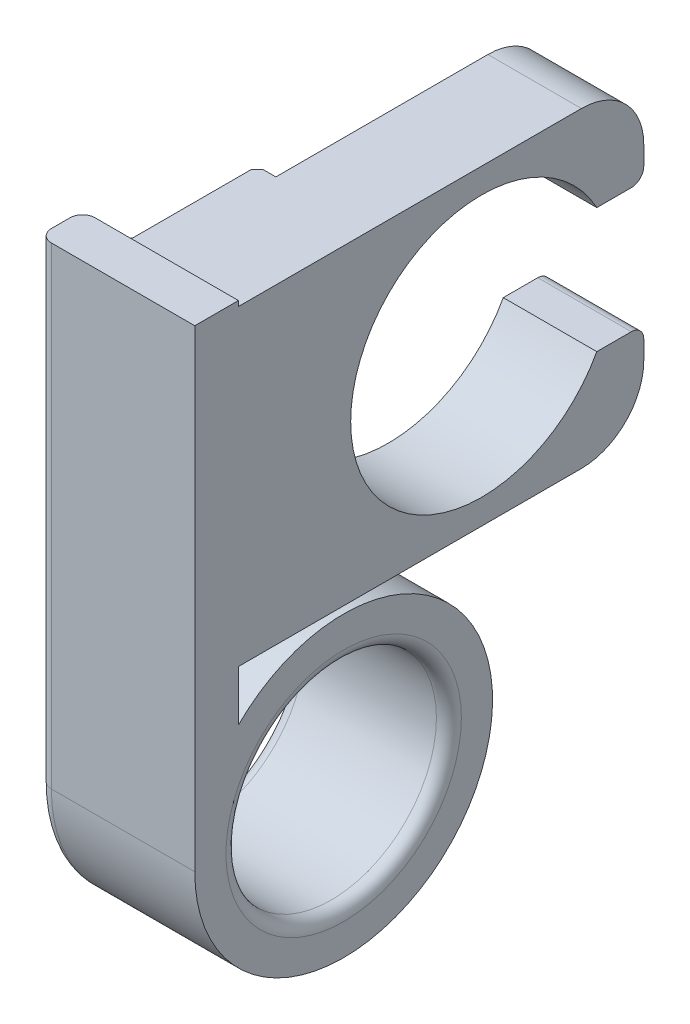
ISO-10303-21;
HEADER;
FILE_DESCRIPTION(('STEP AP214'),'2;1');
FILE_NAME('part.step','',(''),(''),'','','');
FILE_SCHEMA(('AUTOMOTIVE_DESIGN { 1 0 10303 214 1 1 1 1 }'));
ENDSEC;
DATA;
#1=APPLICATION_CONTEXT('core data for automotive mechanical design processes');
#2=APPLICATION_PROTOCOL_DEFINITION('international standard','automotive_design',2000,#1);
#3=PRODUCT_CONTEXT('',#1,'mechanical');
#4=PRODUCT('Part','Part','',(#3));
#5=PRODUCT_RELATED_PRODUCT_CATEGORY('part','',(#4));
#6=PRODUCT_DEFINITION_FORMATION('','',#4);
#7=PRODUCT_DEFINITION_CONTEXT('part definition',#1,'design');
#8=PRODUCT_DEFINITION('design','',#6,#7);
#9=PRODUCT_DEFINITION_SHAPE('','',#8);
#10=(LENGTH_UNIT() NAMED_UNIT(*) SI_UNIT(.MILLI.,.METRE.));
#11=(NAMED_UNIT(*) PLANE_ANGLE_UNIT() SI_UNIT($,.RADIAN.));
#12=(NAMED_UNIT(*) SI_UNIT($,.STERADIAN.) SOLID_ANGLE_UNIT());
#13=UNCERTAINTY_MEASURE_WITH_UNIT(LENGTH_MEASURE(1.E-05),#10,'distance_accuracy_value','');
#14=(GEOMETRIC_REPRESENTATION_CONTEXT(3) GLOBAL_UNCERTAINTY_ASSIGNED_CONTEXT((#13)) GLOBAL_UNIT_ASSIGNED_CONTEXT((#10,
#11,#12)) REPRESENTATION_CONTEXT('',''));
#15=CARTESIAN_POINT('',(0.,0.,0.));
#16=DIRECTION('',(0.,0.,1.));
#17=DIRECTION('',(1.,0.,0.));
#18=AXIS2_PLACEMENT_3D('',#15,#16,#17);
#19=CARTESIAN_POINT('',(0.,75.83,16.875));
#20=DIRECTION('',(0.,0.,1.));
#21=DIRECTION('',(1.,0.,0.));
#22=AXIS2_PLACEMENT_3D('',#19,#20,#21);
#23=PLANE('',#22);
#24=DIRECTION('',(1.,0.,0.));
#25=VECTOR('',#24,1.);
#26=CARTESIAN_POINT('',(10.,75.,16.875));
#27=LINE('',#26,#25);
#28=CARTESIAN_POINT('',(6.00000000000002,75.,16.875));
#29=VERTEX_POINT('',#28);
#30=CARTESIAN_POINT('',(25.,75.,16.875));
#31=VERTEX_POINT('',#30);
#32=EDGE_CURVE('E272',#29,#31,#27,.T.);
#33=ORIENTED_EDGE('',*,*,#32,.F.);
#34=DIRECTION('',(0.,-1.,0.));
#35=VECTOR('',#34,1.);
#36=CARTESIAN_POINT('',(6.00000000000002,75.83,16.875));
#37=LINE('',#36,#35);
#38=CARTESIAN_POINT('',(6.00000000000002,25.,16.875));
#39=VERTEX_POINT('',#38);
#40=EDGE_CURVE('E546',#29,#39,#37,.T.);
#41=ORIENTED_EDGE('',*,*,#40,.T.);
#42=DIRECTION('',(1.,0.,0.));
#43=VECTOR('',#42,1.);
#44=CARTESIAN_POINT('',(10.,25.,16.875));
#45=LINE('',#44,#43);
#46=CARTESIAN_POINT('',(25.,25.,16.875));
#47=VERTEX_POINT('',#46);
#48=EDGE_CURVE('E233',#39,#47,#45,.T.);
#49=ORIENTED_EDGE('',*,*,#48,.T.);
#50=DIRECTION('',(0.,-1.,0.));
#51=VECTOR('',#50,1.);
#52=CARTESIAN_POINT('',(25.,75.83,16.875));
#53=LINE('',#52,#51);
#54=CARTESIAN_POINT('',(25.,16.8893457540545,16.875));
#55=VERTEX_POINT('',#54);
#56=EDGE_CURVE('E298',#47,#55,#53,.T.);
#57=ORIENTED_EDGE('',*,*,#56,.T.);
#58=DIRECTION('',(-1.,0.,0.));
#59=VECTOR('',#58,1.);
#60=CARTESIAN_POINT('',(25.,16.8893457540545,16.875));
#61=LINE('',#60,#59);
#62=CARTESIAN_POINT('',(2.,16.8893457540545,16.875));
#63=VERTEX_POINT('',#62);
#64=EDGE_CURVE('E309',#55,#63,#61,.T.);
#65=ORIENTED_EDGE('',*,*,#64,.T.);
#66=DIRECTION('',(0.,-1.,0.));
#67=VECTOR('',#66,1.);
#68=CARTESIAN_POINT('',(2.,75.83,16.875));
#69=LINE('',#68,#67);
#70=CARTESIAN_POINT('',(2.,75.83,16.875));
#71=VERTEX_POINT('',#70);
#72=EDGE_CURVE('E368',#63,#71,#69,.F.);
#73=ORIENTED_EDGE('',*,*,#72,.T.);
#74=DIRECTION('',(-1.,0.,0.));
#75=VECTOR('',#74,1.);
#76=CARTESIAN_POINT('',(0.,75.83,16.875));
#77=LINE('',#76,#75);
#78=CARTESIAN_POINT('',(25.,75.83,16.875));
#79=VERTEX_POINT('',#78);
#80=EDGE_CURVE('E294',#79,#71,#77,.T.);
#81=ORIENTED_EDGE('',*,*,#80,.F.);
#82=EDGE_CURVE('E301',#79,#31,#53,.T.);
#83=ORIENTED_EDGE('',*,*,#82,.T.);
#84=EDGE_LOOP('',(#33,#41,#49,#57,#65,#73,#81,#83));
#85=FACE_BOUND('',#84,.T.);
#86=ADVANCED_FACE('F49',(#85),#23,.F.);
#87=CARTESIAN_POINT('',(10.,0.,0.));
#88=DIRECTION('',(1.,0.,0.));
#89=DIRECTION('',(0.,0.,-1.));
#90=AXIS2_PLACEMENT_3D('',#87,#88,#89);
#91=PLANE('',#90);
#92=DIRECTION('',(0.,-1.,0.));
#93=VECTOR('',#92,1.);
#94=CARTESIAN_POINT('',(10.,25.,-4.125));
#95=LINE('',#94,#93);
#96=CARTESIAN_POINT('',(10.,75.,-4.125));
#97=VERTEX_POINT('',#96);
#98=CARTESIAN_POINT('',(10.,60.816653826392,-4.125));
#99=VERTEX_POINT('',#98);
#100=EDGE_CURVE('E207',#97,#99,#95,.T.);
#101=ORIENTED_EDGE('',*,*,#100,.F.);
#102=DIRECTION('',(0.,0.,1.));
#103=VECTOR('',#102,1.);
#104=CARTESIAN_POINT('',(10.,75.,0.));
#105=LINE('',#104,#103);
#106=CARTESIAN_POINT('',(10.,75.,-38.125));
#107=VERTEX_POINT('',#106);
#108=EDGE_CURVE('E219',#107,#97,#105,.T.);
#109=ORIENTED_EDGE('',*,*,#108,.F.);
#110=CARTESIAN_POINT('',(10.,65.,-38.125));
#111=DIRECTION('',(1.,0.,0.));
#112=DIRECTION('',(0.,0.,-1.));
#113=AXIS2_PLACEMENT_3D('',#110,#111,#112);
#114=CIRCLE('',#113,10.);
#115=CARTESIAN_POINT('',(10.,65.,-48.125));
#116=VERTEX_POINT('',#115);
#117=EDGE_CURVE('E332',#107,#116,#114,.F.);
#118=ORIENTED_EDGE('',*,*,#117,.T.);
#119=DIRECTION('',(0.,-1.,0.));
#120=VECTOR('',#119,1.);
#121=CARTESIAN_POINT('',(10.,0.,-48.125));
#122=LINE('',#121,#120);
#123=CARTESIAN_POINT('',(10.,62.,-48.125));
#124=VERTEX_POINT('',#123);
#125=EDGE_CURVE('E234',#116,#124,#122,.T.);
#126=ORIENTED_EDGE('',*,*,#125,.T.);
#127=CARTESIAN_POINT('',(10.,62.,-46.125));
#128=DIRECTION('',(1.,0.,0.));
#129=DIRECTION('',(0.,0.,-1.));
#130=AXIS2_PLACEMENT_3D('',#127,#128,#129);
#131=CIRCLE('',#130,2.);
#132=CARTESIAN_POINT('',(10.,60.,-46.125));
#133=VERTEX_POINT('',#132);
#134=EDGE_CURVE('E521',#124,#133,#131,.F.);
#135=ORIENTED_EDGE('',*,*,#134,.T.);
#136=DIRECTION('',(0.,0.,1.));
#137=VECTOR('',#136,1.);
#138=CARTESIAN_POINT('',(10.,60.,0.));
#139=LINE('',#138,#137);
#140=CARTESIAN_POINT('',(10.,60.,-40.5911853126194));
#141=VERTEX_POINT('',#140);
#142=EDGE_CURVE('E242',#133,#141,#139,.T.);
#143=ORIENTED_EDGE('',*,*,#142,.T.);
#144=CARTESIAN_POINT('',(10.,50.,-22.125));
#145=DIRECTION('',(1.,0.,0.));
#146=DIRECTION('',(0.,0.,-1.));
#147=AXIS2_PLACEMENT_3D('',#144,#145,#146);
#148=CIRCLE('',#147,21.);
#149=EDGE_CURVE('E222',#99,#141,#148,.F.);
#150=ORIENTED_EDGE('',*,*,#149,.F.);
#151=EDGE_LOOP('',(#101,#109,#118,#126,#135,#143,#150));
#152=FACE_BOUND('',#151,.T.);
#153=ADVANCED_FACE('F218',(#152),#91,.F.);
#154=DIRECTION('',(0.,-1.,0.));
#155=VECTOR('',#154,1.);
#156=CARTESIAN_POINT('',(10.,0.,-4.125));
#157=LINE('',#156,#155);
#158=CARTESIAN_POINT('',(10.,39.183346173608,-4.125));
#159=VERTEX_POINT('',#158);
#160=CARTESIAN_POINT('',(10.,25.,-4.125));
#161=VERTEX_POINT('',#160);
#162=EDGE_CURVE('E534',#159,#161,#157,.T.);
#163=ORIENTED_EDGE('',*,*,#162,.F.);
#164=CARTESIAN_POINT('',(10.,40.,-40.5911853126194));
#165=VERTEX_POINT('',#164);
#166=EDGE_CURVE('E581',#165,#159,#148,.F.);
#167=ORIENTED_EDGE('',*,*,#166,.F.);
#168=DIRECTION('',(0.,0.,1.));
#169=VECTOR('',#168,1.);
#170=CARTESIAN_POINT('',(10.,40.,0.));
#171=LINE('',#170,#169);
#172=CARTESIAN_POINT('',(10.,40.,-46.125));
#173=VERTEX_POINT('',#172);
#174=EDGE_CURVE('E578',#173,#165,#171,.T.);
#175=ORIENTED_EDGE('',*,*,#174,.F.);
#176=CARTESIAN_POINT('',(10.,38.,-46.125));
#177=DIRECTION('',(1.,0.,0.));
#178=DIRECTION('',(0.,0.,-1.));
#179=AXIS2_PLACEMENT_3D('',#176,#177,#178);
#180=CIRCLE('',#179,2.);
#181=CARTESIAN_POINT('',(10.,38.,-48.125));
#182=VERTEX_POINT('',#181);
#183=EDGE_CURVE('E524',#173,#182,#180,.F.);
#184=ORIENTED_EDGE('',*,*,#183,.T.);
#185=DIRECTION('',(0.,-1.,0.));
#186=VECTOR('',#185,1.);
#187=CARTESIAN_POINT('',(10.,0.,-48.125));
#188=LINE('',#187,#186);
#189=CARTESIAN_POINT('',(10.,35.,-48.125));
#190=VERTEX_POINT('',#189);
#191=EDGE_CURVE('E575',#182,#190,#188,.T.);
#192=ORIENTED_EDGE('',*,*,#191,.T.);
#193=CARTESIAN_POINT('',(10.,35.,-38.125));
#194=DIRECTION('',(1.,0.,0.));
#195=DIRECTION('',(0.,0.,-1.));
#196=AXIS2_PLACEMENT_3D('',#193,#194,#195);
#197=CIRCLE('',#196,10.);
#198=CARTESIAN_POINT('',(10.,25.,-38.125));
#199=VERTEX_POINT('',#198);
#200=EDGE_CURVE('E335',#190,#199,#197,.F.);
#201=ORIENTED_EDGE('',*,*,#200,.T.);
#202=DIRECTION('',(0.,0.,-1.));
#203=VECTOR('',#202,1.);
#204=CARTESIAN_POINT('',(10.,25.,0.));
#205=LINE('',#204,#203);
#206=EDGE_CURVE('E271',#161,#199,#205,.T.);
#207=ORIENTED_EDGE('',*,*,#206,.F.);
#208=EDGE_LOOP('',(#163,#167,#175,#184,#192,#201,#207));
#209=FACE_BOUND('',#208,.T.);
#210=ADVANCED_FACE('F446',(#209),#91,.F.);
#211=CARTESIAN_POINT('',(25.,0.,0.));
#212=DIRECTION('',(-1.,0.,0.));
#213=DIRECTION('',(0.,0.,1.));
#214=AXIS2_PLACEMENT_3D('',#211,#212,#213);
#215=CYLINDRICAL_SURFACE('',#214,23.875);
#216=DIRECTION('',(1.,0.,0.));
#217=VECTOR('',#216,1.);
#218=CARTESIAN_POINT('',(0.,0.,23.875));
#219=LINE('',#218,#217);
#220=CARTESIAN_POINT('',(2.,0.,23.875));
#221=VERTEX_POINT('',#220);
#222=CARTESIAN_POINT('',(25.,0.,23.875));
#223=VERTEX_POINT('',#222);
#224=EDGE_CURVE('E276',#221,#223,#219,.T.);
#225=ORIENTED_EDGE('',*,*,#224,.F.);
#226=CARTESIAN_POINT('',(2.,0.,0.));
#227=DIRECTION('',(1.,0.,0.));
#228=DIRECTION('',(0.,0.,-1.));
#229=AXIS2_PLACEMENT_3D('',#226,#227,#228);
#230=CIRCLE('',#229,23.875);
#231=EDGE_CURVE('E371',#221,#63,#230,.T.);
#232=ORIENTED_EDGE('',*,*,#231,.T.);
#233=ORIENTED_EDGE('',*,*,#64,.F.);
#234=CARTESIAN_POINT('',(25.,0.,0.));
#235=DIRECTION('',(1.,0.,0.));
#236=DIRECTION('',(0.,0.,-1.));
#237=AXIS2_PLACEMENT_3D('',#234,#235,#236);
#238=CIRCLE('',#237,23.875);
#239=EDGE_CURVE('E313',#223,#55,#238,.T.);
#240=ORIENTED_EDGE('',*,*,#239,.F.);
#241=EDGE_LOOP('',(#225,#232,#233,#240));
#242=FACE_BOUND('',#241,.T.);
#243=ADVANCED_FACE('F464',(#242),#215,.T.);
#244=CARTESIAN_POINT('',(25.,0.,0.));
#245=DIRECTION('',(1.,0.,0.));
#246=DIRECTION('',(0.,0.,-1.));
#247=AXIS2_PLACEMENT_3D('',#244,#245,#246);
#248=PLANE('',#247);
#249=CARTESIAN_POINT('',(25.,0.,0.));
#250=DIRECTION('',(1.,0.,0.));
#251=DIRECTION('',(0.,0.,-1.));
#252=AXIS2_PLACEMENT_3D('',#249,#250,#251);
#253=CIRCLE('',#252,18.875);
#254=CARTESIAN_POINT('',(25.,0.,-18.875));
#255=VERTEX_POINT('',#254);
#256=EDGE_CURVE('E382',#255,#255,#253,.F.);
#257=ORIENTED_EDGE('',*,*,#256,.T.);
#258=EDGE_LOOP('',(#257));
#259=FACE_BOUND('',#258,.T.);
#260=DIRECTION('',(0.,-1.,0.));
#261=VECTOR('',#260,1.);
#262=CARTESIAN_POINT('',(25.,0.,-48.125));
#263=LINE('',#262,#261);
#264=CARTESIAN_POINT('',(25.,38.,-48.125));
#265=VERTEX_POINT('',#264);
#266=CARTESIAN_POINT('',(25.,35.,-48.125));
#267=VERTEX_POINT('',#266);
#268=EDGE_CURVE('E250',#265,#267,#263,.T.);
#269=ORIENTED_EDGE('',*,*,#268,.F.);
#270=CARTESIAN_POINT('',(25.,38.,-46.125));
#271=DIRECTION('',(1.,0.,0.));
#272=DIRECTION('',(0.,0.,-1.));
#273=AXIS2_PLACEMENT_3D('',#270,#271,#272);
#274=CIRCLE('',#273,2.);
#275=CARTESIAN_POINT('',(25.,40.,-46.125));
#276=VERTEX_POINT('',#275);
#277=EDGE_CURVE('E516',#265,#276,#274,.T.);
#278=ORIENTED_EDGE('',*,*,#277,.T.);
#279=DIRECTION('',(0.,0.,1.));
#280=VECTOR('',#279,1.);
#281=CARTESIAN_POINT('',(25.,40.,0.));
#282=LINE('',#281,#280);
#283=CARTESIAN_POINT('',(25.,40.,-40.5911853126194));
#284=VERTEX_POINT('',#283);
#285=EDGE_CURVE('E254',#276,#284,#282,.T.);
#286=ORIENTED_EDGE('',*,*,#285,.T.);
#287=CARTESIAN_POINT('',(25.,50.,-22.125));
#288=DIRECTION('',(1.,0.,0.));
#289=DIRECTION('',(0.,0.,-1.));
#290=AXIS2_PLACEMENT_3D('',#287,#288,#289);
#291=CIRCLE('',#290,21.);
#292=CARTESIAN_POINT('',(25.,60.,-40.5911853126194));
#293=VERTEX_POINT('',#292);
#294=EDGE_CURVE('E257',#284,#293,#291,.F.);
#295=ORIENTED_EDGE('',*,*,#294,.T.);
#296=DIRECTION('',(0.,0.,1.));
#297=VECTOR('',#296,1.);
#298=CARTESIAN_POINT('',(25.,60.,0.));
#299=LINE('',#298,#297);
#300=CARTESIAN_POINT('',(25.,60.,-46.125));
#301=VERTEX_POINT('',#300);
#302=EDGE_CURVE('E261',#301,#293,#299,.T.);
#303=ORIENTED_EDGE('',*,*,#302,.F.);
#304=CARTESIAN_POINT('',(25.,62.,-46.125));
#305=DIRECTION('',(1.,0.,0.));
#306=DIRECTION('',(0.,0.,-1.));
#307=AXIS2_PLACEMENT_3D('',#304,#305,#306);
#308=CIRCLE('',#307,2.);
#309=CARTESIAN_POINT('',(25.,62.,-48.125));
#310=VERTEX_POINT('',#309);
#311=EDGE_CURVE('E514',#301,#310,#308,.T.);
#312=ORIENTED_EDGE('',*,*,#311,.T.);
#313=DIRECTION('',(0.,-1.,0.));
#314=VECTOR('',#313,1.);
#315=CARTESIAN_POINT('',(25.,0.,-48.125));
#316=LINE('',#315,#314);
#317=CARTESIAN_POINT('',(25.,65.,-48.125));
#318=VERTEX_POINT('',#317);
#319=EDGE_CURVE('E264',#318,#310,#316,.T.);
#320=ORIENTED_EDGE('',*,*,#319,.F.);
#321=CARTESIAN_POINT('',(25.,65.,-38.125));
#322=DIRECTION('',(1.,0.,0.));
#323=DIRECTION('',(0.,0.,-1.));
#324=AXIS2_PLACEMENT_3D('',#321,#322,#323);
#325=CIRCLE('',#324,10.);
#326=CARTESIAN_POINT('',(25.,75.,-38.125));
#327=VERTEX_POINT('',#326);
#328=EDGE_CURVE('E321',#318,#327,#325,.T.);
#329=ORIENTED_EDGE('',*,*,#328,.T.);
#330=DIRECTION('',(0.,0.,1.));
#331=VECTOR('',#330,1.);
#332=CARTESIAN_POINT('',(25.,75.,0.));
#333=LINE('',#332,#331);
#334=EDGE_CURVE('E268',#327,#31,#333,.T.);
#335=ORIENTED_EDGE('',*,*,#334,.T.);
#336=ORIENTED_EDGE('',*,*,#82,.F.);
#337=DIRECTION('',(0.,0.,-1.));
#338=VECTOR('',#337,1.);
#339=CARTESIAN_POINT('',(25.,75.83,23.875));
#340=LINE('',#339,#338);
#341=CARTESIAN_POINT('',(25.,75.83,23.875));
#342=VERTEX_POINT('',#341);
#343=EDGE_CURVE('E291',#342,#79,#340,.T.);
#344=ORIENTED_EDGE('',*,*,#343,.F.);
#345=DIRECTION('',(0.,-1.,0.));
#346=VECTOR('',#345,1.);
#347=CARTESIAN_POINT('',(25.,75.83,23.875));
#348=LINE('',#347,#346);
#349=EDGE_CURVE('E305',#342,#223,#348,.T.);
#350=ORIENTED_EDGE('',*,*,#349,.T.);
#351=ORIENTED_EDGE('',*,*,#239,.T.);
#352=ORIENTED_EDGE('',*,*,#56,.F.);
#353=DIRECTION('',(0.,0.,-1.));
#354=VECTOR('',#353,1.);
#355=CARTESIAN_POINT('',(25.,25.,0.));
#356=LINE('',#355,#354);
#357=CARTESIAN_POINT('',(25.,25.,-38.125));
#358=VERTEX_POINT('',#357);
#359=EDGE_CURVE('E246',#47,#358,#356,.T.);
#360=ORIENTED_EDGE('',*,*,#359,.T.);
#361=CARTESIAN_POINT('',(25.,35.,-38.125));
#362=DIRECTION('',(1.,0.,0.));
#363=DIRECTION('',(0.,0.,-1.));
#364=AXIS2_PLACEMENT_3D('',#361,#362,#363);
#365=CIRCLE('',#364,10.);
#366=EDGE_CURVE('E324',#358,#267,#365,.T.);
#367=ORIENTED_EDGE('',*,*,#366,.T.);
#368=EDGE_LOOP('',(#269,#278,#286,#295,#303,#312,#320,#329,#335,#336,#344,#350,#351,#352,#360,#367));
#369=FACE_BOUND('',#368,.T.);
#370=ADVANCED_FACE('F461',(#259,#369),#248,.T.);
#371=CARTESIAN_POINT('',(0.,0.,0.));
#372=DIRECTION('',(1.,0.,0.));
#373=DIRECTION('',(0.,0.,-1.));
#374=AXIS2_PLACEMENT_3D('',#371,#372,#373);
#375=PLANE('',#374);
#376=CARTESIAN_POINT('',(0.,0.,0.));
#377=DIRECTION('',(1.,0.,0.));
#378=DIRECTION('',(0.,0.,-1.));
#379=AXIS2_PLACEMENT_3D('',#376,#377,#378);
#380=CIRCLE('',#379,18.875);
#381=CARTESIAN_POINT('',(0.,0.,-18.875));
#382=VERTEX_POINT('',#381);
#383=EDGE_CURVE('E349',#382,#382,#380,.T.);
#384=ORIENTED_EDGE('',*,*,#383,.T.);
#385=EDGE_LOOP('',(#384));
#386=FACE_BOUND('',#385,.T.);
#387=CARTESIAN_POINT('',(0.,0.,0.));
#388=DIRECTION('',(1.,0.,0.));
#389=DIRECTION('',(0.,0.,-1.));
#390=AXIS2_PLACEMENT_3D('',#387,#388,#389);
#391=CIRCLE('',#390,21.875);
#392=CARTESIAN_POINT('',(0.,11.056672193748,18.875));
#393=VERTEX_POINT('',#392);
#394=CARTESIAN_POINT('',(0.,0.,21.875));
#395=VERTEX_POINT('',#394);
#396=EDGE_CURVE('E353',#393,#395,#391,.F.);
#397=ORIENTED_EDGE('',*,*,#396,.T.);
#398=DIRECTION('',(0.,-1.,0.));
#399=VECTOR('',#398,1.);
#400=CARTESIAN_POINT('',(0.,0.,21.875));
#401=LINE('',#400,#399);
#402=CARTESIAN_POINT('',(0.,75.83,21.875));
#403=VERTEX_POINT('',#402);
#404=EDGE_CURVE('E359',#395,#403,#401,.F.);
#405=ORIENTED_EDGE('',*,*,#404,.T.);
#406=DIRECTION('',(0.,0.,1.));
#407=VECTOR('',#406,1.);
#408=CARTESIAN_POINT('',(0.,75.83,23.875));
#409=LINE('',#408,#407);
#410=CARTESIAN_POINT('',(0.,75.83,18.875));
#411=VERTEX_POINT('',#410);
#412=EDGE_CURVE('E284',#411,#403,#409,.T.);
#413=ORIENTED_EDGE('',*,*,#412,.F.);
#414=DIRECTION('',(0.,-1.,0.));
#415=VECTOR('',#414,1.);
#416=CARTESIAN_POINT('',(0.,0.,18.875));
#417=LINE('',#416,#415);
#418=EDGE_CURVE('E356',#411,#393,#417,.T.);
#419=ORIENTED_EDGE('',*,*,#418,.T.);
#420=EDGE_LOOP('',(#397,#405,#413,#419));
#421=FACE_BOUND('',#420,.T.);
#422=ADVANCED_FACE('F459',(#386,#421),#375,.F.);
#423=CARTESIAN_POINT('',(25.,0.,0.));
#424=DIRECTION('',(-1.,0.,0.));
#425=DIRECTION('',(0.,0.,1.));
#426=AXIS2_PLACEMENT_3D('',#423,#424,#425);
#427=CYLINDRICAL_SURFACE('',#426,16.875);
#428=CARTESIAN_POINT('',(2.,0.,0.));
#429=DIRECTION('',(1.,0.,0.));
#430=DIRECTION('',(0.,0.,-1.));
#431=AXIS2_PLACEMENT_3D('',#428,#429,#430);
#432=CIRCLE('',#431,16.875);
#433=CARTESIAN_POINT('',(2.,0.,-16.875));
#434=VERTEX_POINT('',#433);
#435=EDGE_CURVE('E378',#434,#434,#432,.F.);
#436=ORIENTED_EDGE('',*,*,#435,.T.);
#437=EDGE_LOOP('',(#436));
#438=FACE_BOUND('',#437,.T.);
#439=CARTESIAN_POINT('',(23.,0.,0.));
#440=DIRECTION('',(1.,0.,0.));
#441=DIRECTION('',(0.,0.,-1.));
#442=AXIS2_PLACEMENT_3D('',#439,#440,#441);
#443=CIRCLE('',#442,16.875);
#444=CARTESIAN_POINT('',(23.,0.,-16.875));
#445=VERTEX_POINT('',#444);
#446=EDGE_CURVE('E374',#445,#445,#443,.T.);
#447=ORIENTED_EDGE('',*,*,#446,.T.);
#448=EDGE_LOOP('',(#447));
#449=FACE_BOUND('',#448,.T.);
#450=ADVANCED_FACE('F455',(#438,#449),#427,.F.);
#451=CARTESIAN_POINT('',(0.,75.83,23.875));
#452=DIRECTION('',(0.,0.,-1.));
#453=DIRECTION('',(-1.,0.,0.));
#454=AXIS2_PLACEMENT_3D('',#451,#452,#453);
#455=PLANE('',#454);
#456=DIRECTION('',(1.,0.,0.));
#457=VECTOR('',#456,1.);
#458=CARTESIAN_POINT('',(0.,75.83,23.875));
#459=LINE('',#458,#457);
#460=CARTESIAN_POINT('',(2.,75.83,23.875));
#461=VERTEX_POINT('',#460);
#462=EDGE_CURVE('E288',#461,#342,#459,.T.);
#463=ORIENTED_EDGE('',*,*,#462,.F.);
#464=DIRECTION('',(0.,-1.,0.));
#465=VECTOR('',#464,1.);
#466=CARTESIAN_POINT('',(2.,75.83,23.875));
#467=LINE('',#466,#465);
#468=EDGE_CURVE('E345',#461,#221,#467,.T.);
#469=ORIENTED_EDGE('',*,*,#468,.T.);
#470=ORIENTED_EDGE('',*,*,#224,.T.);
#471=ORIENTED_EDGE('',*,*,#349,.F.);
#472=EDGE_LOOP('',(#463,#469,#470,#471));
#473=FACE_BOUND('',#472,.T.);
#474=ADVANCED_FACE('F452',(#473),#455,.F.);
#475=CARTESIAN_POINT('',(0.,75.83,0.));
#476=DIRECTION('',(0.,-1.,0.));
#477=DIRECTION('',(0.,0.,-1.));
#478=AXIS2_PLACEMENT_3D('',#475,#476,#477);
#479=PLANE('',#478);
#480=ORIENTED_EDGE('',*,*,#412,.T.);
#481=CARTESIAN_POINT('',(2.,75.83,21.875));
#482=DIRECTION('',(0.,-1.,0.));
#483=DIRECTION('',(0.,0.,-1.));
#484=AXIS2_PLACEMENT_3D('',#481,#482,#483);
#485=CIRCLE('',#484,2.);
#486=EDGE_CURVE('E365',#403,#461,#485,.F.);
#487=ORIENTED_EDGE('',*,*,#486,.T.);
#488=ORIENTED_EDGE('',*,*,#462,.T.);
#489=ORIENTED_EDGE('',*,*,#343,.T.);
#490=ORIENTED_EDGE('',*,*,#80,.T.);
#491=CARTESIAN_POINT('',(2.,75.83,18.875));
#492=DIRECTION('',(0.,-1.,0.));
#493=DIRECTION('',(0.,0.,-1.));
#494=AXIS2_PLACEMENT_3D('',#491,#492,#493);
#495=CIRCLE('',#494,2.);
#496=EDGE_CURVE('E362',#71,#411,#495,.F.);
#497=ORIENTED_EDGE('',*,*,#496,.T.);
#498=EDGE_LOOP('',(#480,#487,#488,#489,#490,#497));
#499=FACE_BOUND('',#498,.T.);
#500=ADVANCED_FACE('F450',(#499),#479,.F.);
#501=CARTESIAN_POINT('',(10.,75.,0.));
#502=DIRECTION('',(0.,1.,0.));
#503=DIRECTION('',(0.,0.,1.));
#504=AXIS2_PLACEMENT_3D('',#501,#502,#503);
#505=PLANE('',#504);
#506=DIRECTION('',(1.,0.,0.));
#507=VECTOR('',#506,1.);
#508=CARTESIAN_POINT('',(7.,75.,-4.125));
#509=LINE('',#508,#507);
#510=CARTESIAN_POINT('',(8.,75.,-4.125));
#511=VERTEX_POINT('',#510);
#512=EDGE_CURVE('E203',#511,#97,#509,.T.);
#513=ORIENTED_EDGE('',*,*,#512,.F.);
#514=DIRECTION('',(-0.707106781186548,0.,0.707106781186547));
#515=VECTOR('',#514,1.);
#516=CARTESIAN_POINT('',(6.9375,75.,-3.0625));
#517=LINE('',#516,#515);
#518=CARTESIAN_POINT('',(7.,75.,-3.125));
#519=VERTEX_POINT('',#518);
#520=EDGE_CURVE('E553',#511,#519,#517,.T.);
#521=ORIENTED_EDGE('',*,*,#520,.T.);
#522=DIRECTION('',(0.,0.,-1.));
#523=VECTOR('',#522,1.);
#524=CARTESIAN_POINT('',(7.,75.,16.875));
#525=LINE('',#524,#523);
#526=CARTESIAN_POINT('',(7.,75.,15.875));
#527=VERTEX_POINT('',#526);
#528=EDGE_CURVE('E225',#527,#519,#525,.T.);
#529=ORIENTED_EDGE('',*,*,#528,.F.);
#530=DIRECTION('',(-0.707106781186543,0.,0.707106781186552));
#531=VECTOR('',#530,1.);
#532=CARTESIAN_POINT('',(7.,75.,15.875));
#533=LINE('',#532,#531);
#534=EDGE_CURVE('E59',#527,#29,#533,.T.);
#535=ORIENTED_EDGE('',*,*,#534,.T.);
#536=ORIENTED_EDGE('',*,*,#32,.T.);
#537=ORIENTED_EDGE('',*,*,#334,.F.);
#538=DIRECTION('',(1.,0.,0.));
#539=VECTOR('',#538,1.);
#540=CARTESIAN_POINT('',(10.,75.,-38.125));
#541=LINE('',#540,#539);
#542=EDGE_CURVE('E231',#327,#107,#541,.F.);
#543=ORIENTED_EDGE('',*,*,#542,.T.);
#544=ORIENTED_EDGE('',*,*,#108,.T.);
#545=EDGE_LOOP('',(#513,#521,#529,#535,#536,#537,#543,#544));
#546=FACE_BOUND('',#545,.T.);
#547=ADVANCED_FACE('F228',(#546),#505,.T.);
#548=CARTESIAN_POINT('',(10.,0.,-48.125));
#549=DIRECTION('',(0.,0.,1.));
#550=DIRECTION('',(0.,-1.,0.));
#551=AXIS2_PLACEMENT_3D('',#548,#549,#550);
#552=PLANE('',#551);
#553=ORIENTED_EDGE('',*,*,#319,.T.);
#554=DIRECTION('',(1.,0.,0.));
#555=VECTOR('',#554,1.);
#556=CARTESIAN_POINT('',(10.,62.,-48.125));
#557=LINE('',#556,#555);
#558=EDGE_CURVE('E531',#310,#124,#557,.F.);
#559=ORIENTED_EDGE('',*,*,#558,.T.);
#560=ORIENTED_EDGE('',*,*,#125,.F.);
#561=DIRECTION('',(1.,0.,0.));
#562=VECTOR('',#561,1.);
#563=CARTESIAN_POINT('',(25.,65.,-48.125));
#564=LINE('',#563,#562);
#565=EDGE_CURVE('E339',#116,#318,#564,.T.);
#566=ORIENTED_EDGE('',*,*,#565,.T.);
#567=EDGE_LOOP('',(#553,#559,#560,#566));
#568=FACE_BOUND('',#567,.T.);
#569=ADVANCED_FACE('F629',(#568),#552,.F.);
#570=CARTESIAN_POINT('',(10.,60.,0.));
#571=DIRECTION('',(0.,1.,0.));
#572=DIRECTION('',(0.,0.,1.));
#573=AXIS2_PLACEMENT_3D('',#570,#571,#572);
#574=PLANE('',#573);
#575=ORIENTED_EDGE('',*,*,#142,.F.);
#576=DIRECTION('',(1.,0.,0.));
#577=VECTOR('',#576,1.);
#578=CARTESIAN_POINT('',(10.,60.,-46.125));
#579=LINE('',#578,#577);
#580=EDGE_CURVE('E527',#133,#301,#579,.T.);
#581=ORIENTED_EDGE('',*,*,#580,.T.);
#582=ORIENTED_EDGE('',*,*,#302,.T.);
#583=DIRECTION('',(1.,0.,0.));
#584=VECTOR('',#583,1.);
#585=CARTESIAN_POINT('',(10.,60.,-40.5911853126194));
#586=LINE('',#585,#584);
#587=EDGE_CURVE('E277',#141,#293,#586,.T.);
#588=ORIENTED_EDGE('',*,*,#587,.F.);
#589=EDGE_LOOP('',(#575,#581,#582,#588));
#590=FACE_BOUND('',#589,.T.);
#591=ADVANCED_FACE('F591',(#590),#574,.F.);
#592=CARTESIAN_POINT('',(10.,50.,-22.125));
#593=DIRECTION('',(1.,0.,0.));
#594=DIRECTION('',(0.,0.,-1.));
#595=AXIS2_PLACEMENT_3D('',#592,#593,#594);
#596=CYLINDRICAL_SURFACE('',#595,21.);
#597=ORIENTED_EDGE('',*,*,#294,.F.);
#598=DIRECTION('',(1.,0.,0.));
#599=VECTOR('',#598,1.);
#600=CARTESIAN_POINT('',(10.,40.,-40.5911853126194));
#601=LINE('',#600,#599);
#602=EDGE_CURVE('E239',#165,#284,#601,.T.);
#603=ORIENTED_EDGE('',*,*,#602,.F.);
#604=ORIENTED_EDGE('',*,*,#166,.T.);
#605=EDGE_CURVE('E584',#159,#99,#148,.F.);
#606=ORIENTED_EDGE('',*,*,#605,.T.);
#607=ORIENTED_EDGE('',*,*,#149,.T.);
#608=ORIENTED_EDGE('',*,*,#587,.T.);
#609=EDGE_LOOP('',(#597,#603,#604,#606,#607,#608));
#610=FACE_BOUND('',#609,.T.);
#611=ADVANCED_FACE('F595',(#610),#596,.F.);
#612=CARTESIAN_POINT('',(10.,40.,0.));
#613=DIRECTION('',(0.,1.,0.));
#614=DIRECTION('',(0.,0.,1.));
#615=AXIS2_PLACEMENT_3D('',#612,#613,#614);
#616=PLANE('',#615);
#617=ORIENTED_EDGE('',*,*,#285,.F.);
#618=DIRECTION('',(1.,0.,0.));
#619=VECTOR('',#618,1.);
#620=CARTESIAN_POINT('',(10.,40.,-46.125));
#621=LINE('',#620,#619);
#622=EDGE_CURVE('E518',#276,#173,#621,.F.);
#623=ORIENTED_EDGE('',*,*,#622,.T.);
#624=ORIENTED_EDGE('',*,*,#174,.T.);
#625=ORIENTED_EDGE('',*,*,#602,.T.);
#626=EDGE_LOOP('',(#617,#623,#624,#625));
#627=FACE_BOUND('',#626,.T.);
#628=ADVANCED_FACE('F600',(#627),#616,.T.);
#629=CARTESIAN_POINT('',(10.,0.,-48.125));
#630=DIRECTION('',(0.,0.,1.));
#631=DIRECTION('',(0.,-1.,0.));
#632=AXIS2_PLACEMENT_3D('',#629,#630,#631);
#633=PLANE('',#632);
#634=ORIENTED_EDGE('',*,*,#191,.F.);
#635=DIRECTION('',(1.,0.,0.));
#636=VECTOR('',#635,1.);
#637=CARTESIAN_POINT('',(25.,38.,-48.125));
#638=LINE('',#637,#636);
#639=EDGE_CURVE('E386',#182,#265,#638,.T.);
#640=ORIENTED_EDGE('',*,*,#639,.T.);
#641=ORIENTED_EDGE('',*,*,#268,.T.);
#642=DIRECTION('',(1.,0.,0.));
#643=VECTOR('',#642,1.);
#644=CARTESIAN_POINT('',(10.,35.,-48.125));
#645=LINE('',#644,#643);
#646=EDGE_CURVE('E328',#267,#190,#645,.F.);
#647=ORIENTED_EDGE('',*,*,#646,.T.);
#648=EDGE_LOOP('',(#634,#640,#641,#647));
#649=FACE_BOUND('',#648,.T.);
#650=ADVANCED_FACE('F615',(#649),#633,.F.);
#651=CARTESIAN_POINT('',(10.,25.,0.));
#652=DIRECTION('',(0.,-1.,0.));
#653=DIRECTION('',(0.,0.,-1.));
#654=AXIS2_PLACEMENT_3D('',#651,#652,#653);
#655=PLANE('',#654);
#656=DIRECTION('',(0.,0.,1.));
#657=VECTOR('',#656,1.);
#658=CARTESIAN_POINT('',(7.,25.,16.875));
#659=LINE('',#658,#657);
#660=CARTESIAN_POINT('',(7.,25.,-3.12499999999999));
#661=VERTEX_POINT('',#660);
#662=CARTESIAN_POINT('',(7.,25.,15.875));
#663=VERTEX_POINT('',#662);
#664=EDGE_CURVE('E563',#661,#663,#659,.T.);
#665=ORIENTED_EDGE('',*,*,#664,.F.);
#666=DIRECTION('',(0.707106781186548,0.,-0.707106781186547));
#667=VECTOR('',#666,1.);
#668=CARTESIAN_POINT('',(6.93750000000001,25.,-3.06250000000001));
#669=LINE('',#668,#667);
#670=CARTESIAN_POINT('',(8.,25.,-4.125));
#671=VERTEX_POINT('',#670);
#672=EDGE_CURVE('E74',#661,#671,#669,.T.);
#673=ORIENTED_EDGE('',*,*,#672,.T.);
#674=DIRECTION('',(1.,0.,0.));
#675=VECTOR('',#674,1.);
#676=CARTESIAN_POINT('',(7.,25.,-4.125));
#677=LINE('',#676,#675);
#678=EDGE_CURVE('E214',#671,#161,#677,.T.);
#679=ORIENTED_EDGE('',*,*,#678,.T.);
#680=ORIENTED_EDGE('',*,*,#206,.T.);
#681=DIRECTION('',(1.,0.,0.));
#682=VECTOR('',#681,1.);
#683=CARTESIAN_POINT('',(25.,25.,-38.125));
#684=LINE('',#683,#682);
#685=EDGE_CURVE('E317',#199,#358,#684,.T.);
#686=ORIENTED_EDGE('',*,*,#685,.T.);
#687=ORIENTED_EDGE('',*,*,#359,.F.);
#688=ORIENTED_EDGE('',*,*,#48,.F.);
#689=DIRECTION('',(0.707106781186543,0.,-0.707106781186552));
#690=VECTOR('',#689,1.);
#691=CARTESIAN_POINT('',(7.00000000000001,25.,15.875));
#692=LINE('',#691,#690);
#693=EDGE_CURVE('E12',#39,#663,#692,.T.);
#694=ORIENTED_EDGE('',*,*,#693,.T.);
#695=EDGE_LOOP('',(#665,#673,#679,#680,#686,#687,#688,#694));
#696=FACE_BOUND('',#695,.T.);
#697=ADVANCED_FACE('F475',(#696),#655,.T.);
#698=CARTESIAN_POINT('',(10.,35.,-38.125));
#699=DIRECTION('',(-1.,0.,0.));
#700=DIRECTION('',(0.,0.,1.));
#701=AXIS2_PLACEMENT_3D('',#698,#699,#700);
#702=CYLINDRICAL_SURFACE('',#701,10.);
#703=ORIENTED_EDGE('',*,*,#200,.F.);
#704=ORIENTED_EDGE('',*,*,#646,.F.);
#705=ORIENTED_EDGE('',*,*,#366,.F.);
#706=ORIENTED_EDGE('',*,*,#685,.F.);
#707=EDGE_LOOP('',(#703,#704,#705,#706));
#708=FACE_BOUND('',#707,.T.);
#709=ADVANCED_FACE('F472',(#708),#702,.T.);
#710=CARTESIAN_POINT('',(10.,65.,-38.125));
#711=DIRECTION('',(-1.,0.,0.));
#712=DIRECTION('',(0.,0.,1.));
#713=AXIS2_PLACEMENT_3D('',#710,#711,#712);
#714=CYLINDRICAL_SURFACE('',#713,10.);
#715=ORIENTED_EDGE('',*,*,#117,.F.);
#716=ORIENTED_EDGE('',*,*,#542,.F.);
#717=ORIENTED_EDGE('',*,*,#328,.F.);
#718=ORIENTED_EDGE('',*,*,#565,.F.);
#719=EDGE_LOOP('',(#715,#716,#717,#718));
#720=FACE_BOUND('',#719,.T.);
#721=ADVANCED_FACE('F406',(#720),#714,.T.);
#722=CARTESIAN_POINT('',(2.,0.,18.875));
#723=DIRECTION('',(0.,-1.,0.));
#724=DIRECTION('',(0.,0.,-1.));
#725=AXIS2_PLACEMENT_3D('',#722,#723,#724);
#726=CYLINDRICAL_SURFACE('',#725,2.);
#727=ORIENTED_EDGE('',*,*,#496,.F.);
#728=ORIENTED_EDGE('',*,*,#72,.F.);
#729=CARTESIAN_POINT('',(2.,16.8893457540545,16.875));
#730=CARTESIAN_POINT('',(1.97602095702358,16.8893528480805,16.8749969269713));
#731=CARTESIAN_POINT('',(1.95205581086211,16.8883044930584,16.8754315740686));
#732=CARTESIAN_POINT('',(1.90436147019914,16.884166749161,16.8771462553757));
#733=CARTESIAN_POINT('',(1.8806320236509,16.8810798502432,16.8784252582556));
#734=CARTESIAN_POINT('',(1.81062403313202,16.8689663001633,16.8834422435317));
#735=CARTESIAN_POINT('',(1.76490304578542,16.8570828250456,16.8883619003523));
#736=CARTESIAN_POINT('',(1.66546765377957,16.8231395875653,16.902390420371));
#737=CARTESIAN_POINT('',(1.61247204522541,16.799320824369,16.9122218031472));
#738=CARTESIAN_POINT('',(1.51113480751155,16.7440574216235,16.9349670060066));
#739=CARTESIAN_POINT('',(1.46281869574511,16.7125739364799,16.9478965223153));
#740=CARTESIAN_POINT('',(1.34203772358523,16.6226487654688,16.9847007776757));
#741=CARTESIAN_POINT('',(1.2735074171548,16.5597093891487,17.0103434119839));
#742=CARTESIAN_POINT('',(1.14698211916492,16.4253537889784,17.064721663607));
#743=CARTESIAN_POINT('',(1.08900920371904,16.3539203072104,17.0934635664435));
#744=CARTESIAN_POINT('',(0.979435973433806,16.2028702130725,17.1538088212712));
#745=CARTESIAN_POINT('',(0.928165766338409,16.1230447225412,17.1854796661322));
#746=CARTESIAN_POINT('',(0.832871180263973,15.959526679919,17.2498492433344));
#747=CARTESIAN_POINT('',(0.788854759275084,15.8758300080117,17.2825490583306));
#748=CARTESIAN_POINT('',(0.706687735474208,15.7055689577306,17.3485260301594));
#749=CARTESIAN_POINT('',(0.668552008112164,15.6189979590421,17.3818044216034));
#750=CARTESIAN_POINT('',(0.597309063608259,15.4439466681622,17.4485236221128));
#751=CARTESIAN_POINT('',(0.564199597098121,15.3554672504,17.4819643515724));
#752=CARTESIAN_POINT('',(0.489035031428612,15.139029824438,17.5630484358962));
#753=CARTESIAN_POINT('',(0.449174875492956,15.0103056262405,17.6106754892729));
#754=CARTESIAN_POINT('',(0.376493625239927,14.7506980455315,17.7054758023289));
#755=CARTESIAN_POINT('',(0.343675286178429,14.6198138393642,17.7526488775096));
#756=CARTESIAN_POINT('',(0.283911624927715,14.3562814362313,17.8463443900219));
#757=CARTESIAN_POINT('',(0.256974424894818,14.223631064832,17.8928658455404));
#758=CARTESIAN_POINT('',(0.208167230619937,13.9570908354824,17.9850293274338));
#759=CARTESIAN_POINT('',(0.186297951328753,13.8232008054161,18.0306712288951));
#760=CARTESIAN_POINT('',(0.127216320608276,13.4198265169704,18.1661725003541));
#761=CARTESIAN_POINT('',(0.0965792526989567,13.1488666147869,18.2545260639563));
#762=CARTESIAN_POINT('',(0.0488994812762361,12.6045748323923,18.4265184374116));
#763=CARTESIAN_POINT('',(0.031846452046361,12.3312449137944,18.5101607833987));
#764=CARTESIAN_POINT('',(0.0141121706919197,11.9128153547443,18.6339646910573));
#765=CARTESIAN_POINT('',(0.00950202306287375,11.7683976869666,18.6759293639075));
#766=CARTESIAN_POINT('',(0.00297236864355248,11.479228821589,18.7584133513481));
#767=CARTESIAN_POINT('',(0.00105041961926313,11.334478046553,18.7989339452226));
#768=CARTESIAN_POINT('',(0.000128555735919392,11.1493051221384,18.8497805344759));
#769=CARTESIAN_POINT('',(2.07398318070604E-05,11.1090669027638,18.8607699744874));
#770=CARTESIAN_POINT('',(9.04021030411158E-07,11.0647665480438,18.8728031608786));
#771=CARTESIAN_POINT('',(-4.42771317298007E-10,11.0607194475758,18.8739018610859));
#772=CARTESIAN_POINT('',(0.,11.056672193748,18.875));
#773=B_SPLINE_CURVE_WITH_KNOTS('',3,(#729,#730,#731,#732,#733,#734,#735,#736,#737,#738,#739,
#740,#741,#742,#743,#744,#745,#746,#747,#748,#749,#750,#751,#752,#753,#754,#755,#756,#757,#758,
#759,#760,#761,#762,#763,#764,#765,#766,#767,#768,#769,#770,#771,#772),.UNSPECIFIED.,.F.,.F.,(4,
2,2,2,2,2,2,2,2,2,2,2,2,2,2,2,2,2,2,2,2,4),(0.,0.0718848487373233,0.143682056499006,
0.285436484619075,0.461249405767068,0.637972624937294,0.925894691143454,1.21441207383775,
1.514006267443,1.81392698302369,2.11459433638843,2.41512673493897,2.84364238489841,
3.27232539591895,3.70159674697582,4.13092862015394,4.99033340247736,5.84908429526023,
6.30044341474507,6.75139220659196,6.87652811858495,6.88910887696831),.UNSPECIFIED.);
#774=EDGE_CURVE('E251',#393,#63,#773,.F.);
#775=ORIENTED_EDGE('',*,*,#774,.F.);
#776=ORIENTED_EDGE('',*,*,#418,.F.);
#777=EDGE_LOOP('',(#727,#728,#775,#776));
#778=FACE_BOUND('',#777,.T.);
#779=ADVANCED_FACE('F402',(#778),#726,.T.);
#780=CARTESIAN_POINT('',(2.,0.,0.));
#781=DIRECTION('',(1.,0.,0.));
#782=DIRECTION('',(0.,0.,-1.));
#783=AXIS2_PLACEMENT_3D('',#780,#781,#782);
#784=TOROIDAL_SURFACE('',#783,21.875,2.);
#785=ORIENTED_EDGE('',*,*,#774,.T.);
#786=ORIENTED_EDGE('',*,*,#231,.F.);
#787=CARTESIAN_POINT('',(2.,0.,21.875));
#788=DIRECTION('',(0.,1.,0.));
#789=DIRECTION('',(0.,0.,1.));
#790=AXIS2_PLACEMENT_3D('',#787,#788,#789);
#791=CIRCLE('',#790,2.);
#792=EDGE_CURVE('E213',#395,#221,#791,.T.);
#793=ORIENTED_EDGE('',*,*,#792,.F.);
#794=ORIENTED_EDGE('',*,*,#396,.F.);
#795=EDGE_LOOP('',(#785,#786,#793,#794));
#796=FACE_BOUND('',#795,.T.);
#797=ADVANCED_FACE('F399',(#796),#784,.T.);
#798=CARTESIAN_POINT('',(2.,75.83,21.875));
#799=DIRECTION('',(0.,-1.,0.));
#800=DIRECTION('',(0.,0.,-1.));
#801=AXIS2_PLACEMENT_3D('',#798,#799,#800);
#802=CYLINDRICAL_SURFACE('',#801,2.);
#803=ORIENTED_EDGE('',*,*,#486,.F.);
#804=ORIENTED_EDGE('',*,*,#404,.F.);
#805=ORIENTED_EDGE('',*,*,#792,.T.);
#806=ORIENTED_EDGE('',*,*,#468,.F.);
#807=EDGE_LOOP('',(#803,#804,#805,#806));
#808=FACE_BOUND('',#807,.T.);
#809=ADVANCED_FACE('F412',(#808),#802,.T.);
#810=CARTESIAN_POINT('',(2.,0.,0.));
#811=DIRECTION('',(1.,0.,0.));
#812=DIRECTION('',(0.,0.,-1.));
#813=AXIS2_PLACEMENT_3D('',#810,#811,#812);
#814=TOROIDAL_SURFACE('',#813,18.875,2.);
#815=ORIENTED_EDGE('',*,*,#435,.F.);
#816=EDGE_LOOP('',(#815));
#817=FACE_BOUND('',#816,.T.);
#818=ORIENTED_EDGE('',*,*,#383,.F.);
#819=EDGE_LOOP('',(#818));
#820=FACE_BOUND('',#819,.T.);
#821=ADVANCED_FACE('F408',(#817,#820),#814,.T.);
#822=CARTESIAN_POINT('',(23.,0.,0.));
#823=DIRECTION('',(1.,0.,0.));
#824=DIRECTION('',(0.,0.,-1.));
#825=AXIS2_PLACEMENT_3D('',#822,#823,#824);
#826=TOROIDAL_SURFACE('',#825,18.875,2.);
#827=ORIENTED_EDGE('',*,*,#256,.F.);
#828=EDGE_LOOP('',(#827));
#829=FACE_BOUND('',#828,.T.);
#830=ORIENTED_EDGE('',*,*,#446,.F.);
#831=EDGE_LOOP('',(#830));
#832=FACE_BOUND('',#831,.T.);
#833=ADVANCED_FACE('F411',(#829,#832),#826,.T.);
#834=CARTESIAN_POINT('',(10.,38.,-46.125));
#835=DIRECTION('',(-1.,0.,0.));
#836=DIRECTION('',(0.,0.,1.));
#837=AXIS2_PLACEMENT_3D('',#834,#835,#836);
#838=CYLINDRICAL_SURFACE('',#837,2.);
#839=ORIENTED_EDGE('',*,*,#183,.F.);
#840=ORIENTED_EDGE('',*,*,#622,.F.);
#841=ORIENTED_EDGE('',*,*,#277,.F.);
#842=ORIENTED_EDGE('',*,*,#639,.F.);
#843=EDGE_LOOP('',(#839,#840,#841,#842));
#844=FACE_BOUND('',#843,.T.);
#845=ADVANCED_FACE('F416',(#844),#838,.T.);
#846=CARTESIAN_POINT('',(10.,62.,-46.125));
#847=DIRECTION('',(1.,0.,0.));
#848=DIRECTION('',(0.,0.,-1.));
#849=AXIS2_PLACEMENT_3D('',#846,#847,#848);
#850=CYLINDRICAL_SURFACE('',#849,2.);
#851=ORIENTED_EDGE('',*,*,#134,.F.);
#852=ORIENTED_EDGE('',*,*,#558,.F.);
#853=ORIENTED_EDGE('',*,*,#311,.F.);
#854=ORIENTED_EDGE('',*,*,#580,.F.);
#855=EDGE_LOOP('',(#851,#852,#853,#854));
#856=FACE_BOUND('',#855,.T.);
#857=ADVANCED_FACE('F420',(#856),#850,.T.);
#858=CARTESIAN_POINT('',(7.,25.,-4.125));
#859=DIRECTION('',(0.,0.,1.));
#860=DIRECTION('',(0.,-1.,0.));
#861=AXIS2_PLACEMENT_3D('',#858,#859,#860);
#862=PLANE('',#861);
#863=ORIENTED_EDGE('',*,*,#678,.F.);
#864=DIRECTION('',(0.,1.,0.));
#865=VECTOR('',#864,1.);
#866=CARTESIAN_POINT('',(8.,75.,-4.125));
#867=LINE('',#866,#865);
#868=EDGE_CURVE('E66',#671,#511,#867,.T.);
#869=ORIENTED_EDGE('',*,*,#868,.T.);
#870=ORIENTED_EDGE('',*,*,#512,.T.);
#871=ORIENTED_EDGE('',*,*,#100,.T.);
#872=EDGE_CURVE('E226',#99,#159,#95,.T.);
#873=ORIENTED_EDGE('',*,*,#872,.T.);
#874=ORIENTED_EDGE('',*,*,#162,.T.);
#875=EDGE_LOOP('',(#863,#869,#870,#871,#873,#874));
#876=FACE_BOUND('',#875,.T.);
#877=ADVANCED_FACE('F205',(#876),#862,.F.);
#878=CARTESIAN_POINT('',(7.,0.,0.));
#879=DIRECTION('',(-1.,0.,0.));
#880=DIRECTION('',(0.,0.,1.));
#881=AXIS2_PLACEMENT_3D('',#878,#879,#880);
#882=PLANE('',#881);
#883=ORIENTED_EDGE('',*,*,#664,.T.);
#884=DIRECTION('',(0.,1.,0.));
#885=VECTOR('',#884,1.);
#886=CARTESIAN_POINT('',(7.,0.,15.875));
#887=LINE('',#886,#885);
#888=EDGE_CURVE('E542',#663,#527,#887,.T.);
#889=ORIENTED_EDGE('',*,*,#888,.T.);
#890=ORIENTED_EDGE('',*,*,#528,.T.);
#891=DIRECTION('',(0.,-1.,0.));
#892=VECTOR('',#891,1.);
#893=CARTESIAN_POINT('',(7.,25.,-3.125));
#894=LINE('',#893,#892);
#895=EDGE_CURVE('E538',#519,#661,#894,.T.);
#896=ORIENTED_EDGE('',*,*,#895,.T.);
#897=EDGE_LOOP('',(#883,#889,#890,#896));
#898=FACE_BOUND('',#897,.T.);
#899=ADVANCED_FACE('F436',(#898),#882,.T.);
#900=CARTESIAN_POINT('',(10.,0.,0.));
#901=DIRECTION('',(-1.,0.,0.));
#902=DIRECTION('',(0.,0.,1.));
#903=AXIS2_PLACEMENT_3D('',#900,#901,#902);
#904=PLANE('',#903);
#905=ORIENTED_EDGE('',*,*,#605,.F.);
#906=ORIENTED_EDGE('',*,*,#872,.F.);
#907=EDGE_LOOP('',(#905,#906));
#908=FACE_BOUND('',#907,.T.);
#909=ADVANCED_FACE('F429',(#908),#904,.F.);
#910=CARTESIAN_POINT('',(7.,0.,15.875));
#911=DIRECTION('',(0.707106781186552,0.,0.707106781186543));
#912=DIRECTION('',(0.,1.,0.));
#913=AXIS2_PLACEMENT_3D('',#910,#911,#912);
#914=PLANE('',#913);
#915=ORIENTED_EDGE('',*,*,#693,.F.);
#916=ORIENTED_EDGE('',*,*,#40,.F.);
#917=ORIENTED_EDGE('',*,*,#534,.F.);
#918=ORIENTED_EDGE('',*,*,#888,.F.);
#919=EDGE_LOOP('',(#915,#916,#917,#918));
#920=FACE_BOUND('',#919,.T.);
#921=ADVANCED_FACE('F425',(#920),#914,.F.);
#922=CARTESIAN_POINT('',(7.,0.,-3.125));
#923=DIRECTION('',(-0.707106781186547,0.,-0.707106781186548));
#924=DIRECTION('',(0.,1.,0.));
#925=AXIS2_PLACEMENT_3D('',#922,#923,#924);
#926=PLANE('',#925);
#927=ORIENTED_EDGE('',*,*,#520,.F.);
#928=ORIENTED_EDGE('',*,*,#868,.F.);
#929=ORIENTED_EDGE('',*,*,#672,.F.);
#930=ORIENTED_EDGE('',*,*,#895,.F.);
#931=EDGE_LOOP('',(#927,#928,#929,#930));
#932=FACE_BOUND('',#931,.T.);
#933=ADVANCED_FACE('F52',(#932),#926,.T.);
#934=CLOSED_SHELL('',(#86,#153,#210,#243,#370,#422,#450,#474,#500,#547,#569,#591,#611,#628,#650,
#697,#709,#721,#779,#797,#809,#821,#833,#845,#857,#877,#899,#909,#921,#933));
#935=MANIFOLD_SOLID_BREP('B2',#934);
#936=ADVANCED_BREP_SHAPE_REPRESENTATION('',(#18,#935),#14);
#937=SHAPE_DEFINITION_REPRESENTATION(#9,#936);
ENDSEC;
END-ISO-10303-21;
